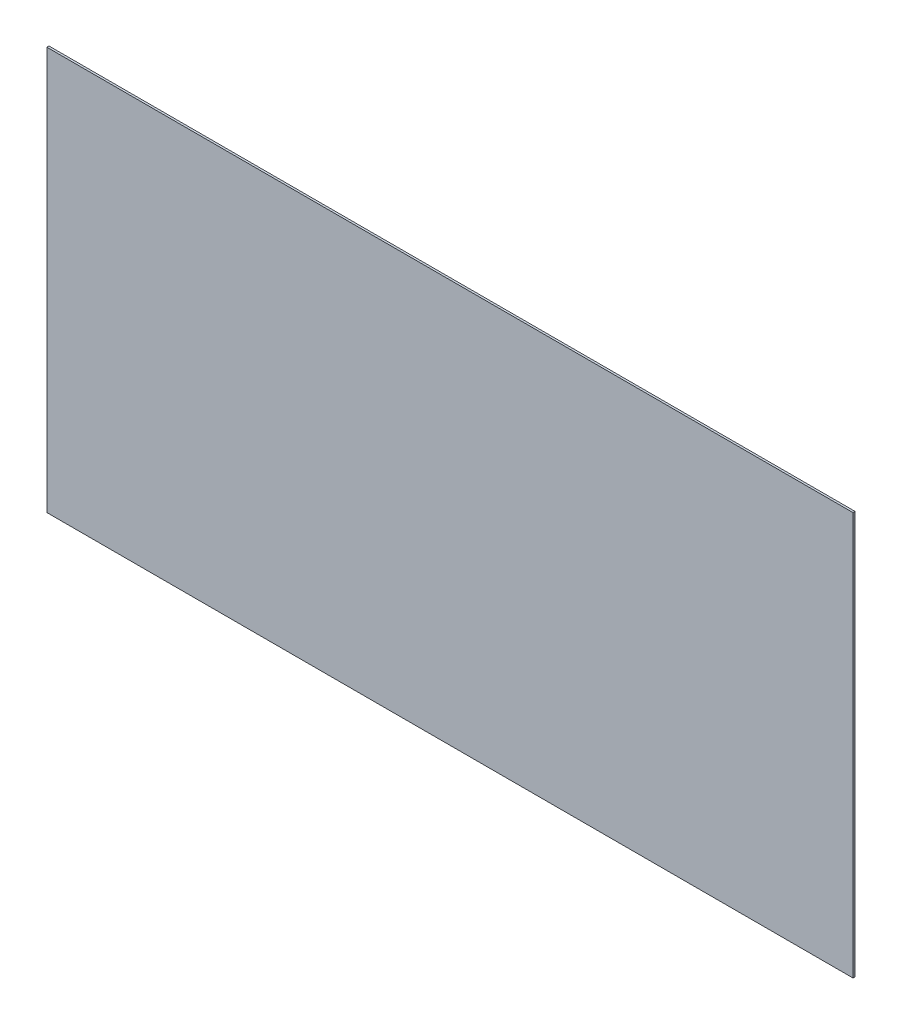
ISO-10303-21;
HEADER;
FILE_DESCRIPTION(('STEP AP214'),'2;1');
FILE_NAME('part.step','',(''),(''),'','','');
FILE_SCHEMA(('AUTOMOTIVE_DESIGN { 1 0 10303 214 1 1 1 1 }'));
ENDSEC;
DATA;
#1=APPLICATION_CONTEXT('core data for automotive mechanical design processes');
#2=APPLICATION_PROTOCOL_DEFINITION('international standard','automotive_design',2000,#1);
#3=PRODUCT_CONTEXT('',#1,'mechanical');
#4=PRODUCT('Part','Part','',(#3));
#5=PRODUCT_RELATED_PRODUCT_CATEGORY('part','',(#4));
#6=PRODUCT_DEFINITION_FORMATION('','',#4);
#7=PRODUCT_DEFINITION_CONTEXT('part definition',#1,'design');
#8=PRODUCT_DEFINITION('design','',#6,#7);
#9=PRODUCT_DEFINITION_SHAPE('','',#8);
#10=(LENGTH_UNIT() NAMED_UNIT(*) SI_UNIT(.MILLI.,.METRE.));
#11=(NAMED_UNIT(*) PLANE_ANGLE_UNIT() SI_UNIT($,.RADIAN.));
#12=(NAMED_UNIT(*) SI_UNIT($,.STERADIAN.) SOLID_ANGLE_UNIT());
#13=UNCERTAINTY_MEASURE_WITH_UNIT(LENGTH_MEASURE(1.E-05),#10,'distance_accuracy_value','');
#14=(GEOMETRIC_REPRESENTATION_CONTEXT(3) GLOBAL_UNCERTAINTY_ASSIGNED_CONTEXT((#13)) GLOBAL_UNIT_ASSIGNED_CONTEXT((#10,
#11,#12)) REPRESENTATION_CONTEXT('',''));
#15=CARTESIAN_POINT('',(0.,0.,0.));
#16=DIRECTION('',(0.,0.,1.));
#17=DIRECTION('',(1.,0.,0.));
#18=AXIS2_PLACEMENT_3D('',#15,#16,#17);
#19=CARTESIAN_POINT('',(609.6,304.8,3.175));
#20=DIRECTION('',(-1.,0.,0.));
#21=DIRECTION('',(0.,0.,1.));
#22=AXIS2_PLACEMENT_3D('',#19,#20,#21);
#23=PLANE('',#22);
#24=DIRECTION('',(0.,1.,0.));
#25=VECTOR('',#24,1.);
#26=CARTESIAN_POINT('',(609.6,304.8,0.));
#27=LINE('',#26,#25);
#28=CARTESIAN_POINT('',(609.6,-304.8,0.));
#29=VERTEX_POINT('',#28);
#30=CARTESIAN_POINT('',(609.6,304.8,0.));
#31=VERTEX_POINT('',#30);
#32=EDGE_CURVE('E107',#29,#31,#27,.T.);
#33=ORIENTED_EDGE('',*,*,#32,.T.);
#34=DIRECTION('',(0.,0.,-1.));
#35=VECTOR('',#34,1.);
#36=CARTESIAN_POINT('',(609.6,304.8,3.175));
#37=LINE('',#36,#35);
#38=CARTESIAN_POINT('',(609.6,304.8,3.175));
#39=VERTEX_POINT('',#38);
#40=EDGE_CURVE('E11',#39,#31,#37,.T.);
#41=ORIENTED_EDGE('',*,*,#40,.F.);
#42=DIRECTION('',(0.,1.,0.));
#43=VECTOR('',#42,1.);
#44=CARTESIAN_POINT('',(609.6,304.8,3.175));
#45=LINE('',#44,#43);
#46=CARTESIAN_POINT('',(609.6,-304.8,3.175));
#47=VERTEX_POINT('',#46);
#48=EDGE_CURVE('E91',#47,#39,#45,.T.);
#49=ORIENTED_EDGE('',*,*,#48,.F.);
#50=DIRECTION('',(0.,0.,-1.));
#51=VECTOR('',#50,1.);
#52=CARTESIAN_POINT('',(609.6,-304.8,3.175));
#53=LINE('',#52,#51);
#54=EDGE_CURVE('E103',#47,#29,#53,.T.);
#55=ORIENTED_EDGE('',*,*,#54,.T.);
#56=EDGE_LOOP('',(#33,#41,#49,#55));
#57=FACE_BOUND('',#56,.T.);
#58=ADVANCED_FACE('F39',(#57),#23,.F.);
#59=CARTESIAN_POINT('',(-609.6,304.8,3.175));
#60=DIRECTION('',(0.,-1.,0.));
#61=DIRECTION('',(0.,0.,-1.));
#62=AXIS2_PLACEMENT_3D('',#59,#60,#61);
#63=PLANE('',#62);
#64=DIRECTION('',(-1.,0.,0.));
#65=VECTOR('',#64,1.);
#66=CARTESIAN_POINT('',(-609.6,304.8,0.));
#67=LINE('',#66,#65);
#68=CARTESIAN_POINT('',(-609.6,304.8,0.));
#69=VERTEX_POINT('',#68);
#70=EDGE_CURVE('E96',#31,#69,#67,.T.);
#71=ORIENTED_EDGE('',*,*,#70,.T.);
#72=DIRECTION('',(0.,0.,-1.));
#73=VECTOR('',#72,1.);
#74=CARTESIAN_POINT('',(-609.6,304.8,3.175));
#75=LINE('',#74,#73);
#76=CARTESIAN_POINT('',(-609.6,304.8,3.175));
#77=VERTEX_POINT('',#76);
#78=EDGE_CURVE('E48',#77,#69,#75,.T.);
#79=ORIENTED_EDGE('',*,*,#78,.F.);
#80=DIRECTION('',(-1.,0.,0.));
#81=VECTOR('',#80,1.);
#82=CARTESIAN_POINT('',(-609.6,304.8,3.175));
#83=LINE('',#82,#81);
#84=EDGE_CURVE('E86',#39,#77,#83,.T.);
#85=ORIENTED_EDGE('',*,*,#84,.F.);
#86=ORIENTED_EDGE('',*,*,#40,.T.);
#87=EDGE_LOOP('',(#71,#79,#85,#86));
#88=FACE_BOUND('',#87,.T.);
#89=ADVANCED_FACE('F95',(#88),#63,.F.);
#90=CARTESIAN_POINT('',(-609.6,304.8,3.175));
#91=DIRECTION('',(1.,0.,0.));
#92=DIRECTION('',(0.,1.,0.));
#93=AXIS2_PLACEMENT_3D('',#90,#91,#92);
#94=PLANE('',#93);
#95=DIRECTION('',(0.,-1.,0.));
#96=VECTOR('',#95,1.);
#97=CARTESIAN_POINT('',(-609.6,304.8,0.));
#98=LINE('',#97,#96);
#99=CARTESIAN_POINT('',(-609.6,-304.8,0.));
#100=VERTEX_POINT('',#99);
#101=EDGE_CURVE('E73',#69,#100,#98,.T.);
#102=ORIENTED_EDGE('',*,*,#101,.T.);
#103=DIRECTION('',(0.,0.,-1.));
#104=VECTOR('',#103,1.);
#105=CARTESIAN_POINT('',(-609.6,-304.8,3.175));
#106=LINE('',#105,#104);
#107=CARTESIAN_POINT('',(-609.6,-304.8,3.175));
#108=VERTEX_POINT('',#107);
#109=EDGE_CURVE('E98',#108,#100,#106,.T.);
#110=ORIENTED_EDGE('',*,*,#109,.F.);
#111=DIRECTION('',(0.,-1.,0.));
#112=VECTOR('',#111,1.);
#113=CARTESIAN_POINT('',(-609.6,304.8,3.175));
#114=LINE('',#113,#112);
#115=EDGE_CURVE('E89',#77,#108,#114,.T.);
#116=ORIENTED_EDGE('',*,*,#115,.F.);
#117=ORIENTED_EDGE('',*,*,#78,.T.);
#118=EDGE_LOOP('',(#102,#110,#116,#117));
#119=FACE_BOUND('',#118,.T.);
#120=ADVANCED_FACE('F99',(#119),#94,.F.);
#121=CARTESIAN_POINT('',(-609.6,-304.8,3.175));
#122=DIRECTION('',(0.,1.,0.));
#123=DIRECTION('',(0.,0.,1.));
#124=AXIS2_PLACEMENT_3D('',#121,#122,#123);
#125=PLANE('',#124);
#126=DIRECTION('',(1.,0.,0.));
#127=VECTOR('',#126,1.);
#128=CARTESIAN_POINT('',(-609.6,-304.8,0.));
#129=LINE('',#128,#127);
#130=EDGE_CURVE('E79',#100,#29,#129,.T.);
#131=ORIENTED_EDGE('',*,*,#130,.T.);
#132=ORIENTED_EDGE('',*,*,#54,.F.);
#133=DIRECTION('',(1.,0.,0.));
#134=VECTOR('',#133,1.);
#135=CARTESIAN_POINT('',(-609.6,-304.8,3.175));
#136=LINE('',#135,#134);
#137=EDGE_CURVE('E56',#108,#47,#136,.T.);
#138=ORIENTED_EDGE('',*,*,#137,.F.);
#139=ORIENTED_EDGE('',*,*,#109,.T.);
#140=EDGE_LOOP('',(#131,#132,#138,#139));
#141=FACE_BOUND('',#140,.T.);
#142=ADVANCED_FACE('F120',(#141),#125,.F.);
#143=CARTESIAN_POINT('',(0.,0.,3.175));
#144=DIRECTION('',(0.,0.,1.));
#145=DIRECTION('',(1.,0.,0.));
#146=AXIS2_PLACEMENT_3D('',#143,#144,#145);
#147=PLANE('',#146);
#148=ORIENTED_EDGE('',*,*,#48,.T.);
#149=ORIENTED_EDGE('',*,*,#84,.T.);
#150=ORIENTED_EDGE('',*,*,#115,.T.);
#151=ORIENTED_EDGE('',*,*,#137,.T.);
#152=EDGE_LOOP('',(#148,#149,#150,#151));
#153=FACE_BOUND('',#152,.T.);
#154=ADVANCED_FACE('F87',(#153),#147,.T.);
#155=CARTESIAN_POINT('',(0.,0.,0.));
#156=DIRECTION('',(0.,0.,1.));
#157=DIRECTION('',(1.,0.,0.));
#158=AXIS2_PLACEMENT_3D('',#155,#156,#157);
#159=PLANE('',#158);
#160=ORIENTED_EDGE('',*,*,#32,.F.);
#161=ORIENTED_EDGE('',*,*,#130,.F.);
#162=ORIENTED_EDGE('',*,*,#101,.F.);
#163=ORIENTED_EDGE('',*,*,#70,.F.);
#164=EDGE_LOOP('',(#160,#161,#162,#163));
#165=FACE_BOUND('',#164,.T.);
#166=ADVANCED_FACE('F123',(#165),#159,.F.);
#167=CLOSED_SHELL('',(#58,#89,#120,#142,#154,#166));
#168=MANIFOLD_SOLID_BREP('B2',#167);
#169=ADVANCED_BREP_SHAPE_REPRESENTATION('',(#18,#168),#14);
#170=SHAPE_DEFINITION_REPRESENTATION(#9,#169);
ENDSEC;
END-ISO-10303-21;
